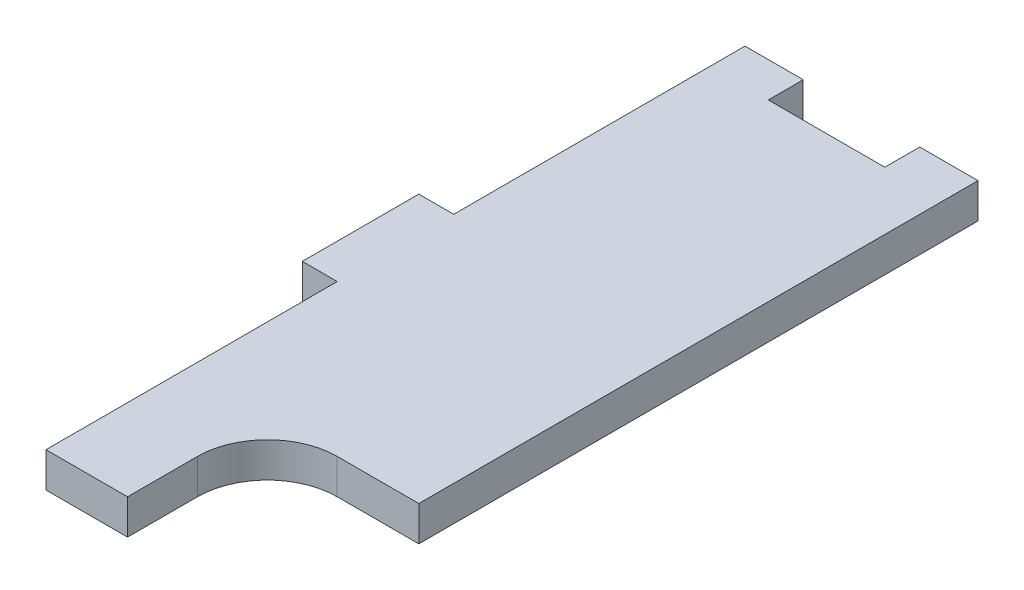
ISO-10303-21;
HEADER;
FILE_DESCRIPTION(('STEP AP214'),'2;1');
FILE_NAME('part.step','',(''),(''),'','','');
FILE_SCHEMA(('AUTOMOTIVE_DESIGN { 1 0 10303 214 1 1 1 1 }'));
ENDSEC;
DATA;
#1=APPLICATION_CONTEXT('core data for automotive mechanical design processes');
#2=APPLICATION_PROTOCOL_DEFINITION('international standard','automotive_design',2000,#1);
#3=PRODUCT_CONTEXT('',#1,'mechanical');
#4=PRODUCT('Part','Part','',(#3));
#5=PRODUCT_RELATED_PRODUCT_CATEGORY('part','',(#4));
#6=PRODUCT_DEFINITION_FORMATION('','',#4);
#7=PRODUCT_DEFINITION_CONTEXT('part definition',#1,'design');
#8=PRODUCT_DEFINITION('design','',#6,#7);
#9=PRODUCT_DEFINITION_SHAPE('','',#8);
#10=(LENGTH_UNIT() NAMED_UNIT(*) SI_UNIT(.MILLI.,.METRE.));
#11=(NAMED_UNIT(*) PLANE_ANGLE_UNIT() SI_UNIT($,.RADIAN.));
#12=(NAMED_UNIT(*) SI_UNIT($,.STERADIAN.) SOLID_ANGLE_UNIT());
#13=UNCERTAINTY_MEASURE_WITH_UNIT(LENGTH_MEASURE(1.E-05),#10,'distance_accuracy_value','');
#14=(GEOMETRIC_REPRESENTATION_CONTEXT(3) GLOBAL_UNCERTAINTY_ASSIGNED_CONTEXT((#13)) GLOBAL_UNIT_ASSIGNED_CONTEXT((#10,
#11,#12)) REPRESENTATION_CONTEXT('',''));
#15=CARTESIAN_POINT('',(0.,0.,0.));
#16=DIRECTION('',(0.,0.,1.));
#17=DIRECTION('',(1.,0.,0.));
#18=AXIS2_PLACEMENT_3D('',#15,#16,#17);
#19=CARTESIAN_POINT('',(-10.,3.,5.00000000000001));
#20=DIRECTION('',(1.,0.,0.));
#21=DIRECTION('',(0.,0.,-1.));
#22=AXIS2_PLACEMENT_3D('',#19,#20,#21);
#23=PLANE('',#22);
#24=DIRECTION('',(0.,0.,1.));
#25=VECTOR('',#24,1.);
#26=CARTESIAN_POINT('',(-10.,0.,5.00000000000001));
#27=LINE('',#26,#25);
#28=CARTESIAN_POINT('',(-10.,0.,5.00000000000001));
#29=VERTEX_POINT('',#28);
#30=CARTESIAN_POINT('',(-9.99999999999999,0.,30.));
#31=VERTEX_POINT('',#30);
#32=EDGE_CURVE('E171',#29,#31,#27,.T.);
#33=ORIENTED_EDGE('',*,*,#32,.T.);
#34=DIRECTION('',(0.,-1.,0.));
#35=VECTOR('',#34,1.);
#36=CARTESIAN_POINT('',(-9.99999999999999,3.,30.));
#37=LINE('',#36,#35);
#38=CARTESIAN_POINT('',(-9.99999999999999,3.,30.));
#39=VERTEX_POINT('',#38);
#40=EDGE_CURVE('E11',#39,#31,#37,.T.);
#41=ORIENTED_EDGE('',*,*,#40,.F.);
#42=DIRECTION('',(0.,0.,1.));
#43=VECTOR('',#42,1.);
#44=CARTESIAN_POINT('',(-10.,3.,5.00000000000001));
#45=LINE('',#44,#43);
#46=CARTESIAN_POINT('',(-10.,3.,5.00000000000001));
#47=VERTEX_POINT('',#46);
#48=EDGE_CURVE('E199',#47,#39,#45,.T.);
#49=ORIENTED_EDGE('',*,*,#48,.F.);
#50=DIRECTION('',(0.,-1.,0.));
#51=VECTOR('',#50,1.);
#52=CARTESIAN_POINT('',(-10.,3.,5.00000000000001));
#53=LINE('',#52,#51);
#54=EDGE_CURVE('E167',#47,#29,#53,.T.);
#55=ORIENTED_EDGE('',*,*,#54,.T.);
#56=EDGE_LOOP('',(#33,#41,#49,#55));
#57=FACE_BOUND('',#56,.T.);
#58=ADVANCED_FACE('F33',(#57),#23,.F.);
#59=CARTESIAN_POINT('',(-2.99999999999999,3.,30.));
#60=DIRECTION('',(0.,0.,-1.));
#61=DIRECTION('',(-1.,0.,0.));
#62=AXIS2_PLACEMENT_3D('',#59,#60,#61);
#63=PLANE('',#62);
#64=DIRECTION('',(1.,0.,0.));
#65=VECTOR('',#64,1.);
#66=CARTESIAN_POINT('',(-2.99999999999999,0.,30.));
#67=LINE('',#66,#65);
#68=CARTESIAN_POINT('',(-2.99999999999999,0.,30.));
#69=VERTEX_POINT('',#68);
#70=EDGE_CURVE('E174',#31,#69,#67,.T.);
#71=ORIENTED_EDGE('',*,*,#70,.T.);
#72=DIRECTION('',(0.,-1.,0.));
#73=VECTOR('',#72,1.);
#74=CARTESIAN_POINT('',(-2.99999999999999,3.,30.));
#75=LINE('',#74,#73);
#76=CARTESIAN_POINT('',(-2.99999999999999,3.,30.));
#77=VERTEX_POINT('',#76);
#78=EDGE_CURVE('E41',#77,#69,#75,.T.);
#79=ORIENTED_EDGE('',*,*,#78,.F.);
#80=DIRECTION('',(1.,0.,0.));
#81=VECTOR('',#80,1.);
#82=CARTESIAN_POINT('',(-2.99999999999999,3.,30.));
#83=LINE('',#82,#81);
#84=EDGE_CURVE('E113',#39,#77,#83,.T.);
#85=ORIENTED_EDGE('',*,*,#84,.F.);
#86=ORIENTED_EDGE('',*,*,#40,.T.);
#87=EDGE_LOOP('',(#71,#79,#85,#86));
#88=FACE_BOUND('',#87,.T.);
#89=ADVANCED_FACE('F292',(#88),#63,.F.);
#90=CARTESIAN_POINT('',(-3.,3.,24.));
#91=DIRECTION('',(-1.,0.,0.));
#92=DIRECTION('',(0.,0.,1.));
#93=AXIS2_PLACEMENT_3D('',#90,#91,#92);
#94=PLANE('',#93);
#95=DIRECTION('',(0.,0.,-1.));
#96=VECTOR('',#95,1.);
#97=CARTESIAN_POINT('',(-3.,0.,24.));
#98=LINE('',#97,#96);
#99=CARTESIAN_POINT('',(-3.,0.,24.));
#100=VERTEX_POINT('',#99);
#101=EDGE_CURVE('E176',#69,#100,#98,.T.);
#102=ORIENTED_EDGE('',*,*,#101,.T.);
#103=DIRECTION('',(0.,-1.,0.));
#104=VECTOR('',#103,1.);
#105=CARTESIAN_POINT('',(-3.,3.,24.));
#106=LINE('',#105,#104);
#107=CARTESIAN_POINT('',(-3.,3.,24.));
#108=VERTEX_POINT('',#107);
#109=EDGE_CURVE('E227',#108,#100,#106,.T.);
#110=ORIENTED_EDGE('',*,*,#109,.F.);
#111=DIRECTION('',(0.,0.,-1.));
#112=VECTOR('',#111,1.);
#113=CARTESIAN_POINT('',(-3.,3.,24.));
#114=LINE('',#113,#112);
#115=EDGE_CURVE('E235',#77,#108,#114,.T.);
#116=ORIENTED_EDGE('',*,*,#115,.F.);
#117=ORIENTED_EDGE('',*,*,#78,.T.);
#118=EDGE_LOOP('',(#102,#110,#116,#117));
#119=FACE_BOUND('',#118,.T.);
#120=ADVANCED_FACE('F233',(#119),#94,.F.);
#121=CARTESIAN_POINT('',(3.,3.,24.));
#122=DIRECTION('',(0.,-1.,0.));
#123=DIRECTION('',(0.,0.,-1.));
#124=AXIS2_PLACEMENT_3D('',#121,#122,#123);
#125=CYLINDRICAL_SURFACE('',#124,6.);
#126=CARTESIAN_POINT('',(3.,0.,24.));
#127=DIRECTION('',(0.,-1.,0.));
#128=DIRECTION('',(0.,0.,1.));
#129=AXIS2_PLACEMENT_3D('',#126,#127,#128);
#130=CIRCLE('',#129,6.);
#131=CARTESIAN_POINT('',(3.00000000000001,0.,18.));
#132=VERTEX_POINT('',#131);
#133=EDGE_CURVE('E178',#100,#132,#130,.T.);
#134=ORIENTED_EDGE('',*,*,#133,.T.);
#135=DIRECTION('',(0.,-1.,0.));
#136=VECTOR('',#135,1.);
#137=CARTESIAN_POINT('',(3.00000000000001,3.,18.));
#138=LINE('',#137,#136);
#139=CARTESIAN_POINT('',(3.00000000000001,3.,18.));
#140=VERTEX_POINT('',#139);
#141=EDGE_CURVE('E224',#140,#132,#138,.T.);
#142=ORIENTED_EDGE('',*,*,#141,.F.);
#143=CARTESIAN_POINT('',(3.,3.,24.));
#144=DIRECTION('',(0.,-1.,0.));
#145=DIRECTION('',(0.,0.,1.));
#146=AXIS2_PLACEMENT_3D('',#143,#144,#145);
#147=CIRCLE('',#146,6.);
#148=EDGE_CURVE('E253',#108,#140,#147,.T.);
#149=ORIENTED_EDGE('',*,*,#148,.F.);
#150=ORIENTED_EDGE('',*,*,#109,.T.);
#151=EDGE_LOOP('',(#134,#142,#149,#150));
#152=FACE_BOUND('',#151,.T.);
#153=ADVANCED_FACE('F244',(#152),#125,.F.);
#154=CARTESIAN_POINT('',(3.,3.,18.));
#155=DIRECTION('',(0.,0.,-1.));
#156=DIRECTION('',(-1.,0.,0.));
#157=AXIS2_PLACEMENT_3D('',#154,#155,#156);
#158=PLANE('',#157);
#159=DIRECTION('',(1.,0.,0.));
#160=VECTOR('',#159,1.);
#161=CARTESIAN_POINT('',(3.,0.,18.));
#162=LINE('',#161,#160);
#163=CARTESIAN_POINT('',(10.,0.,18.));
#164=VERTEX_POINT('',#163);
#165=EDGE_CURVE('E180',#132,#164,#162,.T.);
#166=ORIENTED_EDGE('',*,*,#165,.T.);
#167=DIRECTION('',(0.,-1.,0.));
#168=VECTOR('',#167,1.);
#169=CARTESIAN_POINT('',(10.,3.,18.));
#170=LINE('',#169,#168);
#171=CARTESIAN_POINT('',(10.,3.,18.));
#172=VERTEX_POINT('',#171);
#173=EDGE_CURVE('E221',#172,#164,#170,.T.);
#174=ORIENTED_EDGE('',*,*,#173,.F.);
#175=DIRECTION('',(1.,0.,0.));
#176=VECTOR('',#175,1.);
#177=CARTESIAN_POINT('',(3.,3.,18.));
#178=LINE('',#177,#176);
#179=EDGE_CURVE('E250',#140,#172,#178,.T.);
#180=ORIENTED_EDGE('',*,*,#179,.F.);
#181=ORIENTED_EDGE('',*,*,#141,.T.);
#182=EDGE_LOOP('',(#166,#174,#180,#181));
#183=FACE_BOUND('',#182,.T.);
#184=ADVANCED_FACE('F248',(#183),#158,.F.);
#185=CARTESIAN_POINT('',(10.,3.,-30.));
#186=DIRECTION('',(-1.,0.,0.));
#187=DIRECTION('',(0.,0.,1.));
#188=AXIS2_PLACEMENT_3D('',#185,#186,#187);
#189=PLANE('',#188);
#190=DIRECTION('',(0.,0.,-1.));
#191=VECTOR('',#190,1.);
#192=CARTESIAN_POINT('',(10.,0.,-30.));
#193=LINE('',#192,#191);
#194=CARTESIAN_POINT('',(10.,0.,-30.));
#195=VERTEX_POINT('',#194);
#196=EDGE_CURVE('E182',#164,#195,#193,.T.);
#197=ORIENTED_EDGE('',*,*,#196,.T.);
#198=DIRECTION('',(0.,-1.,0.));
#199=VECTOR('',#198,1.);
#200=CARTESIAN_POINT('',(10.,3.,-30.));
#201=LINE('',#200,#199);
#202=CARTESIAN_POINT('',(10.,3.,-30.));
#203=VERTEX_POINT('',#202);
#204=EDGE_CURVE('E218',#203,#195,#201,.T.);
#205=ORIENTED_EDGE('',*,*,#204,.F.);
#206=DIRECTION('',(0.,0.,-1.));
#207=VECTOR('',#206,1.);
#208=CARTESIAN_POINT('',(10.,3.,-30.));
#209=LINE('',#208,#207);
#210=EDGE_CURVE('E252',#172,#203,#209,.T.);
#211=ORIENTED_EDGE('',*,*,#210,.F.);
#212=ORIENTED_EDGE('',*,*,#173,.T.);
#213=EDGE_LOOP('',(#197,#205,#211,#212));
#214=FACE_BOUND('',#213,.T.);
#215=ADVANCED_FACE('F305',(#214),#189,.F.);
#216=CARTESIAN_POINT('',(10.,3.,-30.));
#217=DIRECTION('',(0.,0.,1.));
#218=DIRECTION('',(1.,0.,0.));
#219=AXIS2_PLACEMENT_3D('',#216,#217,#218);
#220=PLANE('',#219);
#221=DIRECTION('',(-1.,0.,0.));
#222=VECTOR('',#221,1.);
#223=CARTESIAN_POINT('',(10.,0.,-30.));
#224=LINE('',#223,#222);
#225=CARTESIAN_POINT('',(5.,0.,-30.));
#226=VERTEX_POINT('',#225);
#227=EDGE_CURVE('E184',#195,#226,#224,.T.);
#228=ORIENTED_EDGE('',*,*,#227,.T.);
#229=DIRECTION('',(0.,-1.,0.));
#230=VECTOR('',#229,1.);
#231=CARTESIAN_POINT('',(5.,3.,-30.));
#232=LINE('',#231,#230);
#233=CARTESIAN_POINT('',(5.,3.,-30.));
#234=VERTEX_POINT('',#233);
#235=EDGE_CURVE('E215',#234,#226,#232,.T.);
#236=ORIENTED_EDGE('',*,*,#235,.F.);
#237=DIRECTION('',(-1.,0.,0.));
#238=VECTOR('',#237,1.);
#239=CARTESIAN_POINT('',(10.,3.,-30.));
#240=LINE('',#239,#238);
#241=EDGE_CURVE('E255',#203,#234,#240,.T.);
#242=ORIENTED_EDGE('',*,*,#241,.F.);
#243=ORIENTED_EDGE('',*,*,#204,.T.);
#244=EDGE_LOOP('',(#228,#236,#242,#243));
#245=FACE_BOUND('',#244,.T.);
#246=ADVANCED_FACE('F308',(#245),#220,.F.);
#247=CARTESIAN_POINT('',(5.,3.,-30.));
#248=DIRECTION('',(1.,0.,0.));
#249=DIRECTION('',(0.,0.,-1.));
#250=AXIS2_PLACEMENT_3D('',#247,#248,#249);
#251=PLANE('',#250);
#252=DIRECTION('',(0.,0.,1.));
#253=VECTOR('',#252,1.);
#254=CARTESIAN_POINT('',(5.,0.,-30.));
#255=LINE('',#254,#253);
#256=CARTESIAN_POINT('',(5.,0.,-27.));
#257=VERTEX_POINT('',#256);
#258=EDGE_CURVE('E186',#226,#257,#255,.T.);
#259=ORIENTED_EDGE('',*,*,#258,.T.);
#260=DIRECTION('',(0.,-1.,0.));
#261=VECTOR('',#260,1.);
#262=CARTESIAN_POINT('',(5.,3.,-27.));
#263=LINE('',#262,#261);
#264=CARTESIAN_POINT('',(5.,3.,-27.));
#265=VERTEX_POINT('',#264);
#266=EDGE_CURVE('E212',#265,#257,#263,.T.);
#267=ORIENTED_EDGE('',*,*,#266,.F.);
#268=DIRECTION('',(0.,0.,1.));
#269=VECTOR('',#268,1.);
#270=CARTESIAN_POINT('',(5.,3.,-30.));
#271=LINE('',#270,#269);
#272=EDGE_CURVE('E261',#234,#265,#271,.T.);
#273=ORIENTED_EDGE('',*,*,#272,.F.);
#274=ORIENTED_EDGE('',*,*,#235,.T.);
#275=EDGE_LOOP('',(#259,#267,#273,#274));
#276=FACE_BOUND('',#275,.T.);
#277=ADVANCED_FACE('F312',(#276),#251,.F.);
#278=CARTESIAN_POINT('',(-5.,3.,-27.));
#279=DIRECTION('',(0.,0.,1.));
#280=DIRECTION('',(1.,0.,0.));
#281=AXIS2_PLACEMENT_3D('',#278,#279,#280);
#282=PLANE('',#281);
#283=DIRECTION('',(-1.,0.,0.));
#284=VECTOR('',#283,1.);
#285=CARTESIAN_POINT('',(-5.,0.,-27.));
#286=LINE('',#285,#284);
#287=CARTESIAN_POINT('',(-5.,0.,-27.));
#288=VERTEX_POINT('',#287);
#289=EDGE_CURVE('E188',#257,#288,#286,.T.);
#290=ORIENTED_EDGE('',*,*,#289,.T.);
#291=DIRECTION('',(0.,-1.,0.));
#292=VECTOR('',#291,1.);
#293=CARTESIAN_POINT('',(-5.,3.,-27.));
#294=LINE('',#293,#292);
#295=CARTESIAN_POINT('',(-5.,3.,-27.));
#296=VERTEX_POINT('',#295);
#297=EDGE_CURVE('E209',#296,#288,#294,.T.);
#298=ORIENTED_EDGE('',*,*,#297,.F.);
#299=DIRECTION('',(-1.,0.,0.));
#300=VECTOR('',#299,1.);
#301=CARTESIAN_POINT('',(-5.,3.,-27.));
#302=LINE('',#301,#300);
#303=EDGE_CURVE('E263',#265,#296,#302,.T.);
#304=ORIENTED_EDGE('',*,*,#303,.F.);
#305=ORIENTED_EDGE('',*,*,#266,.T.);
#306=EDGE_LOOP('',(#290,#298,#304,#305));
#307=FACE_BOUND('',#306,.T.);
#308=ADVANCED_FACE('F316',(#307),#282,.F.);
#309=CARTESIAN_POINT('',(-5.,3.,-30.));
#310=DIRECTION('',(-1.,0.,0.));
#311=DIRECTION('',(0.,0.,1.));
#312=AXIS2_PLACEMENT_3D('',#309,#310,#311);
#313=PLANE('',#312);
#314=DIRECTION('',(0.,0.,-1.));
#315=VECTOR('',#314,1.);
#316=CARTESIAN_POINT('',(-5.,0.,-30.));
#317=LINE('',#316,#315);
#318=CARTESIAN_POINT('',(-5.,0.,-30.));
#319=VERTEX_POINT('',#318);
#320=EDGE_CURVE('E190',#288,#319,#317,.T.);
#321=ORIENTED_EDGE('',*,*,#320,.T.);
#322=DIRECTION('',(0.,-1.,0.));
#323=VECTOR('',#322,1.);
#324=CARTESIAN_POINT('',(-5.,3.,-30.));
#325=LINE('',#324,#323);
#326=CARTESIAN_POINT('',(-5.,3.,-30.));
#327=VERTEX_POINT('',#326);
#328=EDGE_CURVE('E206',#327,#319,#325,.T.);
#329=ORIENTED_EDGE('',*,*,#328,.F.);
#330=DIRECTION('',(0.,0.,-1.));
#331=VECTOR('',#330,1.);
#332=CARTESIAN_POINT('',(-5.,3.,-30.));
#333=LINE('',#332,#331);
#334=EDGE_CURVE('E265',#296,#327,#333,.T.);
#335=ORIENTED_EDGE('',*,*,#334,.F.);
#336=ORIENTED_EDGE('',*,*,#297,.T.);
#337=EDGE_LOOP('',(#321,#329,#335,#336));
#338=FACE_BOUND('',#337,.T.);
#339=ADVANCED_FACE('F320',(#338),#313,.F.);
#340=CARTESIAN_POINT('',(-5.,3.,-30.));
#341=DIRECTION('',(0.,0.,1.));
#342=DIRECTION('',(1.,0.,0.));
#343=AXIS2_PLACEMENT_3D('',#340,#341,#342);
#344=PLANE('',#343);
#345=DIRECTION('',(-1.,0.,0.));
#346=VECTOR('',#345,1.);
#347=CARTESIAN_POINT('',(-5.,0.,-30.));
#348=LINE('',#347,#346);
#349=CARTESIAN_POINT('',(-10.,0.,-30.));
#350=VERTEX_POINT('',#349);
#351=EDGE_CURVE('E192',#319,#350,#348,.T.);
#352=ORIENTED_EDGE('',*,*,#351,.T.);
#353=DIRECTION('',(0.,-1.,0.));
#354=VECTOR('',#353,1.);
#355=CARTESIAN_POINT('',(-10.,3.,-30.));
#356=LINE('',#355,#354);
#357=CARTESIAN_POINT('',(-10.,3.,-30.));
#358=VERTEX_POINT('',#357);
#359=EDGE_CURVE('E203',#358,#350,#356,.T.);
#360=ORIENTED_EDGE('',*,*,#359,.F.);
#361=DIRECTION('',(-1.,0.,0.));
#362=VECTOR('',#361,1.);
#363=CARTESIAN_POINT('',(-5.,3.,-30.));
#364=LINE('',#363,#362);
#365=EDGE_CURVE('E267',#327,#358,#364,.T.);
#366=ORIENTED_EDGE('',*,*,#365,.F.);
#367=ORIENTED_EDGE('',*,*,#328,.T.);
#368=EDGE_LOOP('',(#352,#360,#366,#367));
#369=FACE_BOUND('',#368,.T.);
#370=ADVANCED_FACE('F273',(#369),#344,.F.);
#371=CARTESIAN_POINT('',(-10.,3.,-30.));
#372=DIRECTION('',(1.,0.,0.));
#373=DIRECTION('',(0.,0.,-1.));
#374=AXIS2_PLACEMENT_3D('',#371,#372,#373);
#375=PLANE('',#374);
#376=DIRECTION('',(0.,0.,1.));
#377=VECTOR('',#376,1.);
#378=CARTESIAN_POINT('',(-10.,0.,-30.));
#379=LINE('',#378,#377);
#380=CARTESIAN_POINT('',(-10.,0.,-4.99999999999999));
#381=VERTEX_POINT('',#380);
#382=EDGE_CURVE('E194',#350,#381,#379,.T.);
#383=ORIENTED_EDGE('',*,*,#382,.T.);
#384=DIRECTION('',(0.,-1.,0.));
#385=VECTOR('',#384,1.);
#386=CARTESIAN_POINT('',(-10.,3.,-4.99999999999999));
#387=LINE('',#386,#385);
#388=CARTESIAN_POINT('',(-10.,3.,-4.99999999999999));
#389=VERTEX_POINT('',#388);
#390=EDGE_CURVE('E162',#389,#381,#387,.T.);
#391=ORIENTED_EDGE('',*,*,#390,.F.);
#392=DIRECTION('',(0.,0.,1.));
#393=VECTOR('',#392,1.);
#394=CARTESIAN_POINT('',(-10.,3.,-30.));
#395=LINE('',#394,#393);
#396=EDGE_CURVE('E153',#358,#389,#395,.T.);
#397=ORIENTED_EDGE('',*,*,#396,.F.);
#398=ORIENTED_EDGE('',*,*,#359,.T.);
#399=EDGE_LOOP('',(#383,#391,#397,#398));
#400=FACE_BOUND('',#399,.T.);
#401=ADVANCED_FACE('F277',(#400),#375,.F.);
#402=CARTESIAN_POINT('',(-10.,3.,-4.99999999999999));
#403=DIRECTION('',(0.,0.,1.));
#404=DIRECTION('',(1.,0.,0.));
#405=AXIS2_PLACEMENT_3D('',#402,#403,#404);
#406=PLANE('',#405);
#407=DIRECTION('',(-1.,0.,0.));
#408=VECTOR('',#407,1.);
#409=CARTESIAN_POINT('',(-10.,0.,-4.99999999999999));
#410=LINE('',#409,#408);
#411=CARTESIAN_POINT('',(-13.,0.,-4.99999999999999));
#412=VERTEX_POINT('',#411);
#413=EDGE_CURVE('E161',#381,#412,#410,.T.);
#414=ORIENTED_EDGE('',*,*,#413,.T.);
#415=DIRECTION('',(0.,-1.,0.));
#416=VECTOR('',#415,1.);
#417=CARTESIAN_POINT('',(-13.,3.,-4.99999999999999));
#418=LINE('',#417,#416);
#419=CARTESIAN_POINT('',(-13.,3.,-4.99999999999999));
#420=VERTEX_POINT('',#419);
#421=EDGE_CURVE('E158',#420,#412,#418,.T.);
#422=ORIENTED_EDGE('',*,*,#421,.F.);
#423=DIRECTION('',(-1.,0.,0.));
#424=VECTOR('',#423,1.);
#425=CARTESIAN_POINT('',(-10.,3.,-4.99999999999999));
#426=LINE('',#425,#424);
#427=EDGE_CURVE('E147',#389,#420,#426,.T.);
#428=ORIENTED_EDGE('',*,*,#427,.F.);
#429=ORIENTED_EDGE('',*,*,#390,.T.);
#430=EDGE_LOOP('',(#414,#422,#428,#429));
#431=FACE_BOUND('',#430,.T.);
#432=ADVANCED_FACE('F159',(#431),#406,.F.);
#433=CARTESIAN_POINT('',(-13.,3.,-4.99999999999999));
#434=DIRECTION('',(1.,0.,0.));
#435=DIRECTION('',(0.,0.,-1.));
#436=AXIS2_PLACEMENT_3D('',#433,#434,#435);
#437=PLANE('',#436);
#438=DIRECTION('',(0.,0.,1.));
#439=VECTOR('',#438,1.);
#440=CARTESIAN_POINT('',(-13.,0.,-4.99999999999999));
#441=LINE('',#440,#439);
#442=CARTESIAN_POINT('',(-13.,0.,5.00000000000001));
#443=VERTEX_POINT('',#442);
#444=EDGE_CURVE('E99',#412,#443,#441,.T.);
#445=ORIENTED_EDGE('',*,*,#444,.T.);
#446=DIRECTION('',(0.,-1.,0.));
#447=VECTOR('',#446,1.);
#448=CARTESIAN_POINT('',(-13.,3.,5.00000000000001));
#449=LINE('',#448,#447);
#450=CARTESIAN_POINT('',(-13.,3.,5.00000000000001));
#451=VERTEX_POINT('',#450);
#452=EDGE_CURVE('E163',#451,#443,#449,.T.);
#453=ORIENTED_EDGE('',*,*,#452,.F.);
#454=DIRECTION('',(0.,0.,1.));
#455=VECTOR('',#454,1.);
#456=CARTESIAN_POINT('',(-13.,3.,-4.99999999999999));
#457=LINE('',#456,#455);
#458=EDGE_CURVE('E151',#420,#451,#457,.T.);
#459=ORIENTED_EDGE('',*,*,#458,.F.);
#460=ORIENTED_EDGE('',*,*,#421,.T.);
#461=EDGE_LOOP('',(#445,#453,#459,#460));
#462=FACE_BOUND('',#461,.T.);
#463=ADVANCED_FACE('F165',(#462),#437,.F.);
#464=CARTESIAN_POINT('',(-10.,3.,5.00000000000001));
#465=DIRECTION('',(0.,0.,-1.));
#466=DIRECTION('',(-1.,0.,0.));
#467=AXIS2_PLACEMENT_3D('',#464,#465,#466);
#468=PLANE('',#467);
#469=DIRECTION('',(1.,0.,0.));
#470=VECTOR('',#469,1.);
#471=CARTESIAN_POINT('',(-10.,0.,5.00000000000001));
#472=LINE('',#471,#470);
#473=EDGE_CURVE('E105',#443,#29,#472,.T.);
#474=ORIENTED_EDGE('',*,*,#473,.T.);
#475=ORIENTED_EDGE('',*,*,#54,.F.);
#476=DIRECTION('',(1.,0.,0.));
#477=VECTOR('',#476,1.);
#478=CARTESIAN_POINT('',(-10.,3.,5.00000000000001));
#479=LINE('',#478,#477);
#480=EDGE_CURVE('E49',#451,#47,#479,.T.);
#481=ORIENTED_EDGE('',*,*,#480,.F.);
#482=ORIENTED_EDGE('',*,*,#452,.T.);
#483=EDGE_LOOP('',(#474,#475,#481,#482));
#484=FACE_BOUND('',#483,.T.);
#485=ADVANCED_FACE('F281',(#484),#468,.F.);
#486=CARTESIAN_POINT('',(3.,3.,24.));
#487=DIRECTION('',(0.,1.,0.));
#488=DIRECTION('',(0.,0.,1.));
#489=AXIS2_PLACEMENT_3D('',#486,#487,#488);
#490=PLANE('',#489);
#491=ORIENTED_EDGE('',*,*,#48,.T.);
#492=ORIENTED_EDGE('',*,*,#84,.T.);
#493=ORIENTED_EDGE('',*,*,#115,.T.);
#494=ORIENTED_EDGE('',*,*,#148,.T.);
#495=ORIENTED_EDGE('',*,*,#179,.T.);
#496=ORIENTED_EDGE('',*,*,#210,.T.);
#497=ORIENTED_EDGE('',*,*,#241,.T.);
#498=ORIENTED_EDGE('',*,*,#272,.T.);
#499=ORIENTED_EDGE('',*,*,#303,.T.);
#500=ORIENTED_EDGE('',*,*,#334,.T.);
#501=ORIENTED_EDGE('',*,*,#365,.T.);
#502=ORIENTED_EDGE('',*,*,#396,.T.);
#503=ORIENTED_EDGE('',*,*,#427,.T.);
#504=ORIENTED_EDGE('',*,*,#458,.T.);
#505=ORIENTED_EDGE('',*,*,#480,.T.);
#506=EDGE_LOOP('',(#491,#492,#493,#494,#495,#496,#497,#498,#499,#500,#501,#502,#503,#504,#505));
#507=FACE_BOUND('',#506,.T.);
#508=ADVANCED_FACE('F149',(#507),#490,.T.);
#509=CARTESIAN_POINT('',(3.,0.,24.));
#510=DIRECTION('',(0.,1.,0.));
#511=DIRECTION('',(0.,0.,1.));
#512=AXIS2_PLACEMENT_3D('',#509,#510,#511);
#513=PLANE('',#512);
#514=ORIENTED_EDGE('',*,*,#32,.F.);
#515=ORIENTED_EDGE('',*,*,#473,.F.);
#516=ORIENTED_EDGE('',*,*,#444,.F.);
#517=ORIENTED_EDGE('',*,*,#413,.F.);
#518=ORIENTED_EDGE('',*,*,#382,.F.);
#519=ORIENTED_EDGE('',*,*,#351,.F.);
#520=ORIENTED_EDGE('',*,*,#320,.F.);
#521=ORIENTED_EDGE('',*,*,#289,.F.);
#522=ORIENTED_EDGE('',*,*,#258,.F.);
#523=ORIENTED_EDGE('',*,*,#227,.F.);
#524=ORIENTED_EDGE('',*,*,#196,.F.);
#525=ORIENTED_EDGE('',*,*,#165,.F.);
#526=ORIENTED_EDGE('',*,*,#133,.F.);
#527=ORIENTED_EDGE('',*,*,#101,.F.);
#528=ORIENTED_EDGE('',*,*,#70,.F.);
#529=EDGE_LOOP('',(#514,#515,#516,#517,#518,#519,#520,#521,#522,#523,#524,#525,#526,#527,#528));
#530=FACE_BOUND('',#529,.T.);
#531=ADVANCED_FACE('F239',(#530),#513,.F.);
#532=CLOSED_SHELL('',(#58,#89,#120,#153,#184,#215,#246,#277,#308,#339,#370,#401,#432,#463,#485,
#508,#531));
#533=MANIFOLD_SOLID_BREP('B2',#532);
#534=ADVANCED_BREP_SHAPE_REPRESENTATION('',(#18,#533),#14);
#535=SHAPE_DEFINITION_REPRESENTATION(#9,#534);
ENDSEC;
END-ISO-10303-21;
